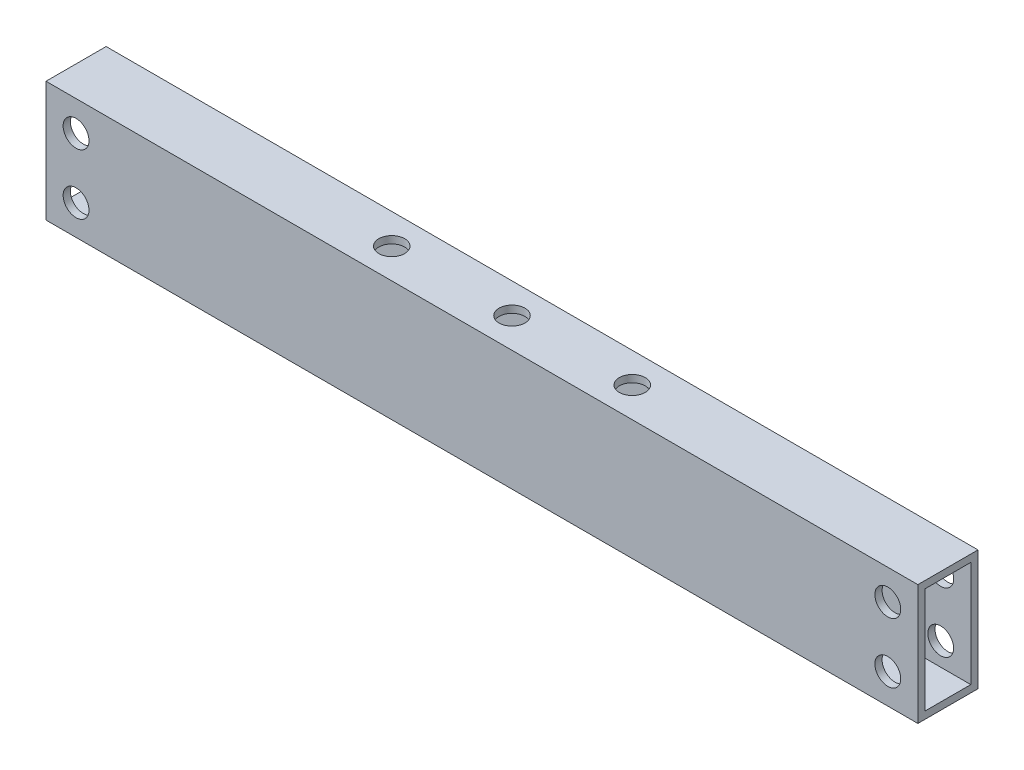
ISO-10303-21;
HEADER;
FILE_DESCRIPTION(('STEP AP214'),'2;1');
FILE_NAME('part.step','',(''),(''),'','','');
FILE_SCHEMA(('AUTOMOTIVE_DESIGN { 1 0 10303 214 1 1 1 1 }'));
ENDSEC;
DATA;
#1=APPLICATION_CONTEXT('core data for automotive mechanical design processes');
#2=APPLICATION_PROTOCOL_DEFINITION('international standard','automotive_design',2000,#1);
#3=PRODUCT_CONTEXT('',#1,'mechanical');
#4=PRODUCT('Part','Part','',(#3));
#5=PRODUCT_RELATED_PRODUCT_CATEGORY('part','',(#4));
#6=PRODUCT_DEFINITION_FORMATION('','',#4);
#7=PRODUCT_DEFINITION_CONTEXT('part definition',#1,'design');
#8=PRODUCT_DEFINITION('design','',#6,#7);
#9=PRODUCT_DEFINITION_SHAPE('','',#8);
#10=(LENGTH_UNIT() NAMED_UNIT(*) SI_UNIT(.MILLI.,.METRE.));
#11=(NAMED_UNIT(*) PLANE_ANGLE_UNIT() SI_UNIT($,.RADIAN.));
#12=(NAMED_UNIT(*) SI_UNIT($,.STERADIAN.) SOLID_ANGLE_UNIT());
#13=UNCERTAINTY_MEASURE_WITH_UNIT(LENGTH_MEASURE(1.E-05),#10,'distance_accuracy_value','');
#14=(GEOMETRIC_REPRESENTATION_CONTEXT(3) GLOBAL_UNCERTAINTY_ASSIGNED_CONTEXT((#13)) GLOBAL_UNIT_ASSIGNED_CONTEXT((#10,
#11,#12)) REPRESENTATION_CONTEXT('',''));
#15=CARTESIAN_POINT('',(0.,0.,0.));
#16=DIRECTION('',(0.,0.,1.));
#17=DIRECTION('',(1.,0.,0.));
#18=AXIS2_PLACEMENT_3D('',#15,#16,#17);
#19=CARTESIAN_POINT('',(145.,0.,0.));
#20=DIRECTION('',(1.,0.,0.));
#21=DIRECTION('',(0.,0.,-1.));
#22=AXIS2_PLACEMENT_3D('',#19,#20,#21);
#23=PLANE('',#22);
#24=DIRECTION('',(0.,1.,0.));
#25=VECTOR('',#24,1.);
#26=CARTESIAN_POINT('',(145.,10.,-5.));
#27=LINE('',#26,#25);
#28=CARTESIAN_POINT('',(145.,-10.,-5.));
#29=VERTEX_POINT('',#28);
#30=CARTESIAN_POINT('',(145.,10.,-5.));
#31=VERTEX_POINT('',#30);
#32=EDGE_CURVE('E164',#29,#31,#27,.T.);
#33=ORIENTED_EDGE('',*,*,#32,.T.);
#34=DIRECTION('',(0.,0.,1.));
#35=VECTOR('',#34,1.);
#36=CARTESIAN_POINT('',(145.,10.,5.));
#37=LINE('',#36,#35);
#38=CARTESIAN_POINT('',(145.,10.,5.));
#39=VERTEX_POINT('',#38);
#40=EDGE_CURVE('E167',#31,#39,#37,.T.);
#41=ORIENTED_EDGE('',*,*,#40,.T.);
#42=DIRECTION('',(0.,-1.,0.));
#43=VECTOR('',#42,1.);
#44=CARTESIAN_POINT('',(145.,10.,5.));
#45=LINE('',#44,#43);
#46=CARTESIAN_POINT('',(145.,-10.,5.));
#47=VERTEX_POINT('',#46);
#48=EDGE_CURVE('E170',#39,#47,#45,.T.);
#49=ORIENTED_EDGE('',*,*,#48,.T.);
#50=DIRECTION('',(0.,0.,-1.));
#51=VECTOR('',#50,1.);
#52=CARTESIAN_POINT('',(145.,-10.,5.));
#53=LINE('',#52,#51);
#54=EDGE_CURVE('E172',#47,#29,#53,.T.);
#55=ORIENTED_EDGE('',*,*,#54,.T.);
#56=EDGE_LOOP('',(#33,#41,#49,#55));
#57=FACE_BOUND('',#56,.T.);
#58=DIRECTION('',(0.,0.,1.));
#59=VECTOR('',#58,1.);
#60=CARTESIAN_POINT('',(145.,8.8,5.));
#61=LINE('',#60,#59);
#62=CARTESIAN_POINT('',(145.,8.8,-3.8));
#63=VERTEX_POINT('',#62);
#64=CARTESIAN_POINT('',(145.,8.8,3.8));
#65=VERTEX_POINT('',#64);
#66=EDGE_CURVE('E134',#63,#65,#61,.T.);
#67=ORIENTED_EDGE('',*,*,#66,.F.);
#68=DIRECTION('',(0.,1.,0.));
#69=VECTOR('',#68,1.);
#70=CARTESIAN_POINT('',(145.,10.,-3.8));
#71=LINE('',#70,#69);
#72=CARTESIAN_POINT('',(145.,-8.8,-3.8));
#73=VERTEX_POINT('',#72);
#74=EDGE_CURVE('E126',#73,#63,#71,.T.);
#75=ORIENTED_EDGE('',*,*,#74,.F.);
#76=DIRECTION('',(0.,0.,-1.));
#77=VECTOR('',#76,1.);
#78=CARTESIAN_POINT('',(145.,-8.8,5.));
#79=LINE('',#78,#77);
#80=CARTESIAN_POINT('',(145.,-8.8,3.8));
#81=VERTEX_POINT('',#80);
#82=EDGE_CURVE('E148',#81,#73,#79,.T.);
#83=ORIENTED_EDGE('',*,*,#82,.F.);
#84=DIRECTION('',(0.,-1.,0.));
#85=VECTOR('',#84,1.);
#86=CARTESIAN_POINT('',(145.,10.,3.8));
#87=LINE('',#86,#85);
#88=EDGE_CURVE('E146',#65,#81,#87,.T.);
#89=ORIENTED_EDGE('',*,*,#88,.F.);
#90=EDGE_LOOP('',(#67,#75,#83,#89));
#91=FACE_BOUND('',#90,.T.);
#92=ADVANCED_FACE('F59',(#57,#91),#23,.T.);
#93=CARTESIAN_POINT('',(0.,0.,0.));
#94=DIRECTION('',(1.,0.,0.));
#95=DIRECTION('',(0.,0.,-1.));
#96=AXIS2_PLACEMENT_3D('',#93,#94,#95);
#97=PLANE('',#96);
#98=DIRECTION('',(0.,1.,0.));
#99=VECTOR('',#98,1.);
#100=CARTESIAN_POINT('',(0.,10.,-5.));
#101=LINE('',#100,#99);
#102=CARTESIAN_POINT('',(0.,-10.,-5.));
#103=VERTEX_POINT('',#102);
#104=CARTESIAN_POINT('',(0.,10.,-5.));
#105=VERTEX_POINT('',#104);
#106=EDGE_CURVE('E142',#103,#105,#101,.T.);
#107=ORIENTED_EDGE('',*,*,#106,.F.);
#108=DIRECTION('',(0.,0.,-1.));
#109=VECTOR('',#108,1.);
#110=CARTESIAN_POINT('',(0.,-10.,5.));
#111=LINE('',#110,#109);
#112=CARTESIAN_POINT('',(0.,-10.,5.));
#113=VERTEX_POINT('',#112);
#114=EDGE_CURVE('E168',#113,#103,#111,.T.);
#115=ORIENTED_EDGE('',*,*,#114,.F.);
#116=DIRECTION('',(0.,-1.,0.));
#117=VECTOR('',#116,1.);
#118=CARTESIAN_POINT('',(0.,10.,5.));
#119=LINE('',#118,#117);
#120=CARTESIAN_POINT('',(0.,10.,5.));
#121=VERTEX_POINT('',#120);
#122=EDGE_CURVE('E179',#121,#113,#119,.T.);
#123=ORIENTED_EDGE('',*,*,#122,.F.);
#124=DIRECTION('',(0.,0.,1.));
#125=VECTOR('',#124,1.);
#126=CARTESIAN_POINT('',(0.,10.,5.));
#127=LINE('',#126,#125);
#128=EDGE_CURVE('E177',#105,#121,#127,.T.);
#129=ORIENTED_EDGE('',*,*,#128,.F.);
#130=EDGE_LOOP('',(#107,#115,#123,#129));
#131=FACE_BOUND('',#130,.T.);
#132=DIRECTION('',(0.,1.,0.));
#133=VECTOR('',#132,1.);
#134=CARTESIAN_POINT('',(0.,10.,-3.8));
#135=LINE('',#134,#133);
#136=CARTESIAN_POINT('',(0.,-8.8,-3.8));
#137=VERTEX_POINT('',#136);
#138=CARTESIAN_POINT('',(0.,8.8,-3.8));
#139=VERTEX_POINT('',#138);
#140=EDGE_CURVE('E84',#137,#139,#135,.T.);
#141=ORIENTED_EDGE('',*,*,#140,.T.);
#142=DIRECTION('',(0.,0.,1.));
#143=VECTOR('',#142,1.);
#144=CARTESIAN_POINT('',(0.,8.8,5.));
#145=LINE('',#144,#143);
#146=CARTESIAN_POINT('',(0.,8.8,3.8));
#147=VERTEX_POINT('',#146);
#148=EDGE_CURVE('E141',#139,#147,#145,.T.);
#149=ORIENTED_EDGE('',*,*,#148,.T.);
#150=DIRECTION('',(0.,-1.,0.));
#151=VECTOR('',#150,1.);
#152=CARTESIAN_POINT('',(0.,10.,3.8));
#153=LINE('',#152,#151);
#154=CARTESIAN_POINT('',(0.,-8.8,3.8));
#155=VERTEX_POINT('',#154);
#156=EDGE_CURVE('E156',#147,#155,#153,.T.);
#157=ORIENTED_EDGE('',*,*,#156,.T.);
#158=DIRECTION('',(0.,0.,-1.));
#159=VECTOR('',#158,1.);
#160=CARTESIAN_POINT('',(0.,-8.8,5.));
#161=LINE('',#160,#159);
#162=EDGE_CURVE('E135',#155,#137,#161,.T.);
#163=ORIENTED_EDGE('',*,*,#162,.T.);
#164=EDGE_LOOP('',(#141,#149,#157,#163));
#165=FACE_BOUND('',#164,.T.);
#166=ADVANCED_FACE('F283',(#131,#165),#97,.F.);
#167=CARTESIAN_POINT('',(145.,10.,-5.));
#168=DIRECTION('',(0.,0.,1.));
#169=DIRECTION('',(0.,-1.,0.));
#170=AXIS2_PLACEMENT_3D('',#167,#168,#169);
#171=PLANE('',#170);
#172=CARTESIAN_POINT('',(140.,-5.,-5.));
#173=DIRECTION('',(0.,0.,1.));
#174=DIRECTION('',(-1.,0.,0.));
#175=AXIS2_PLACEMENT_3D('',#172,#173,#174);
#176=CIRCLE('',#175,2.15000000000002);
#177=CARTESIAN_POINT('',(137.85,-5.,-5.));
#178=VERTEX_POINT('',#177);
#179=EDGE_CURVE('E323',#178,#178,#176,.T.);
#180=ORIENTED_EDGE('',*,*,#179,.T.);
#181=EDGE_LOOP('',(#180));
#182=FACE_BOUND('',#181,.T.);
#183=CARTESIAN_POINT('',(5.,4.99999999999998,-5.));
#184=DIRECTION('',(0.,0.,1.));
#185=DIRECTION('',(-1.,0.,0.));
#186=AXIS2_PLACEMENT_3D('',#183,#184,#185);
#187=CIRCLE('',#186,2.15);
#188=CARTESIAN_POINT('',(2.85,4.99999999999998,-5.));
#189=VERTEX_POINT('',#188);
#190=EDGE_CURVE('E330',#189,#189,#187,.T.);
#191=ORIENTED_EDGE('',*,*,#190,.T.);
#192=EDGE_LOOP('',(#191));
#193=FACE_BOUND('',#192,.T.);
#194=CARTESIAN_POINT('',(5.,-5.00000000000002,-5.));
#195=DIRECTION('',(0.,0.,1.));
#196=DIRECTION('',(1.,0.,0.));
#197=AXIS2_PLACEMENT_3D('',#194,#195,#196);
#198=CIRCLE('',#197,2.15);
#199=CARTESIAN_POINT('',(7.15000000000001,-5.00000000000002,-5.));
#200=VERTEX_POINT('',#199);
#201=EDGE_CURVE('E331',#200,#200,#198,.T.);
#202=ORIENTED_EDGE('',*,*,#201,.T.);
#203=EDGE_LOOP('',(#202));
#204=FACE_BOUND('',#203,.T.);
#205=CARTESIAN_POINT('',(140.,5.,-5.));
#206=DIRECTION('',(0.,0.,1.));
#207=DIRECTION('',(1.,0.,0.));
#208=AXIS2_PLACEMENT_3D('',#205,#206,#207);
#209=CIRCLE('',#208,2.15000000000002);
#210=CARTESIAN_POINT('',(142.15,5.,-5.));
#211=VERTEX_POINT('',#210);
#212=EDGE_CURVE('E205',#211,#211,#209,.T.);
#213=ORIENTED_EDGE('',*,*,#212,.T.);
#214=EDGE_LOOP('',(#213));
#215=FACE_BOUND('',#214,.T.);
#216=ORIENTED_EDGE('',*,*,#106,.T.);
#217=DIRECTION('',(-1.,0.,0.));
#218=VECTOR('',#217,1.);
#219=CARTESIAN_POINT('',(145.,10.,-5.));
#220=LINE('',#219,#218);
#221=EDGE_CURVE('E12',#31,#105,#220,.T.);
#222=ORIENTED_EDGE('',*,*,#221,.F.);
#223=ORIENTED_EDGE('',*,*,#32,.F.);
#224=DIRECTION('',(-1.,0.,0.));
#225=VECTOR('',#224,1.);
#226=CARTESIAN_POINT('',(145.,-10.,-5.));
#227=LINE('',#226,#225);
#228=EDGE_CURVE('E174',#29,#103,#227,.T.);
#229=ORIENTED_EDGE('',*,*,#228,.T.);
#230=EDGE_LOOP('',(#216,#222,#223,#229));
#231=FACE_BOUND('',#230,.T.);
#232=ADVANCED_FACE('F61',(#182,#193,#204,#215,#231),#171,.F.);
#233=CARTESIAN_POINT('',(145.,10.,5.));
#234=DIRECTION('',(0.,-1.,0.));
#235=DIRECTION('',(0.,0.,-1.));
#236=AXIS2_PLACEMENT_3D('',#233,#234,#235);
#237=PLANE('',#236);
#238=CARTESIAN_POINT('',(92.5,10.,0.));
#239=DIRECTION('',(0.,1.,0.));
#240=DIRECTION('',(0.,0.,1.));
#241=AXIS2_PLACEMENT_3D('',#238,#239,#240);
#242=CIRCLE('',#241,2.15);
#243=CARTESIAN_POINT('',(92.5,10.,2.15));
#244=VERTEX_POINT('',#243);
#245=EDGE_CURVE('E229',#244,#244,#242,.T.);
#246=ORIENTED_EDGE('',*,*,#245,.F.);
#247=EDGE_LOOP('',(#246));
#248=FACE_BOUND('',#247,.T.);
#249=CARTESIAN_POINT('',(52.5,10.,0.));
#250=DIRECTION('',(0.,1.,0.));
#251=DIRECTION('',(0.,0.,-1.));
#252=AXIS2_PLACEMENT_3D('',#249,#250,#251);
#253=CIRCLE('',#252,2.15);
#254=CARTESIAN_POINT('',(52.5,10.,-2.15));
#255=VERTEX_POINT('',#254);
#256=EDGE_CURVE('E235',#255,#255,#253,.T.);
#257=ORIENTED_EDGE('',*,*,#256,.F.);
#258=EDGE_LOOP('',(#257));
#259=FACE_BOUND('',#258,.T.);
#260=CARTESIAN_POINT('',(72.5,10.,0.));
#261=DIRECTION('',(0.,1.,0.));
#262=DIRECTION('',(0.,0.,1.));
#263=AXIS2_PLACEMENT_3D('',#260,#261,#262);
#264=CIRCLE('',#263,2.15);
#265=CARTESIAN_POINT('',(72.5,10.,2.15));
#266=VERTEX_POINT('',#265);
#267=EDGE_CURVE('E226',#266,#266,#264,.T.);
#268=ORIENTED_EDGE('',*,*,#267,.F.);
#269=EDGE_LOOP('',(#268));
#270=FACE_BOUND('',#269,.T.);
#271=ORIENTED_EDGE('',*,*,#128,.T.);
#272=DIRECTION('',(-1.,0.,0.));
#273=VECTOR('',#272,1.);
#274=CARTESIAN_POINT('',(145.,10.,5.));
#275=LINE('',#274,#273);
#276=EDGE_CURVE('E68',#39,#121,#275,.T.);
#277=ORIENTED_EDGE('',*,*,#276,.F.);
#278=ORIENTED_EDGE('',*,*,#40,.F.);
#279=ORIENTED_EDGE('',*,*,#221,.T.);
#280=EDGE_LOOP('',(#271,#277,#278,#279));
#281=FACE_BOUND('',#280,.T.);
#282=ADVANCED_FACE('F269',(#248,#259,#270,#281),#237,.F.);
#283=CARTESIAN_POINT('',(145.,10.,5.));
#284=DIRECTION('',(0.,0.,-1.));
#285=DIRECTION('',(0.,1.,0.));
#286=AXIS2_PLACEMENT_3D('',#283,#284,#285);
#287=PLANE('',#286);
#288=CARTESIAN_POINT('',(140.,-5.,5.));
#289=DIRECTION('',(0.,0.,1.));
#290=DIRECTION('',(-1.,0.,0.));
#291=AXIS2_PLACEMENT_3D('',#288,#289,#290);
#292=CIRCLE('',#291,2.15000000000002);
#293=CARTESIAN_POINT('',(137.85,-5.,5.));
#294=VERTEX_POINT('',#293);
#295=EDGE_CURVE('E310',#294,#294,#292,.T.);
#296=ORIENTED_EDGE('',*,*,#295,.F.);
#297=EDGE_LOOP('',(#296));
#298=FACE_BOUND('',#297,.T.);
#299=CARTESIAN_POINT('',(5.,4.99999999999998,5.));
#300=DIRECTION('',(0.,0.,1.));
#301=DIRECTION('',(-1.,0.,0.));
#302=AXIS2_PLACEMENT_3D('',#299,#300,#301);
#303=CIRCLE('',#302,2.15);
#304=CARTESIAN_POINT('',(2.85,4.99999999999998,5.));
#305=VERTEX_POINT('',#304);
#306=EDGE_CURVE('E314',#305,#305,#303,.T.);
#307=ORIENTED_EDGE('',*,*,#306,.F.);
#308=EDGE_LOOP('',(#307));
#309=FACE_BOUND('',#308,.T.);
#310=CARTESIAN_POINT('',(5.,-5.00000000000002,5.));
#311=DIRECTION('',(0.,0.,1.));
#312=DIRECTION('',(1.,0.,0.));
#313=AXIS2_PLACEMENT_3D('',#310,#311,#312);
#314=CIRCLE('',#313,2.15);
#315=CARTESIAN_POINT('',(7.15000000000001,-5.00000000000002,5.));
#316=VERTEX_POINT('',#315);
#317=EDGE_CURVE('E318',#316,#316,#314,.T.);
#318=ORIENTED_EDGE('',*,*,#317,.F.);
#319=EDGE_LOOP('',(#318));
#320=FACE_BOUND('',#319,.T.);
#321=CARTESIAN_POINT('',(140.,5.,5.));
#322=DIRECTION('',(0.,0.,1.));
#323=DIRECTION('',(1.,0.,0.));
#324=AXIS2_PLACEMENT_3D('',#321,#322,#323);
#325=CIRCLE('',#324,2.15000000000002);
#326=CARTESIAN_POINT('',(142.15,5.,5.));
#327=VERTEX_POINT('',#326);
#328=EDGE_CURVE('E321',#327,#327,#325,.T.);
#329=ORIENTED_EDGE('',*,*,#328,.F.);
#330=EDGE_LOOP('',(#329));
#331=FACE_BOUND('',#330,.T.);
#332=ORIENTED_EDGE('',*,*,#122,.T.);
#333=DIRECTION('',(-1.,0.,0.));
#334=VECTOR('',#333,1.);
#335=CARTESIAN_POINT('',(145.,-10.,5.));
#336=LINE('',#335,#334);
#337=EDGE_CURVE('E184',#47,#113,#336,.T.);
#338=ORIENTED_EDGE('',*,*,#337,.F.);
#339=ORIENTED_EDGE('',*,*,#48,.F.);
#340=ORIENTED_EDGE('',*,*,#276,.T.);
#341=EDGE_LOOP('',(#332,#338,#339,#340));
#342=FACE_BOUND('',#341,.T.);
#343=ADVANCED_FACE('F272',(#298,#309,#320,#331,#342),#287,.F.);
#344=CARTESIAN_POINT('',(145.,-10.,5.));
#345=DIRECTION('',(0.,1.,0.));
#346=DIRECTION('',(0.,0.,1.));
#347=AXIS2_PLACEMENT_3D('',#344,#345,#346);
#348=PLANE('',#347);
#349=CARTESIAN_POINT('',(92.5,-9.99999999999999,0.));
#350=DIRECTION('',(0.,1.,0.));
#351=DIRECTION('',(0.,0.,1.));
#352=AXIS2_PLACEMENT_3D('',#349,#350,#351);
#353=CIRCLE('',#352,2.15);
#354=CARTESIAN_POINT('',(92.5,-9.99999999999999,2.15));
#355=VERTEX_POINT('',#354);
#356=EDGE_CURVE('E193',#355,#355,#353,.T.);
#357=ORIENTED_EDGE('',*,*,#356,.T.);
#358=EDGE_LOOP('',(#357));
#359=FACE_BOUND('',#358,.T.);
#360=CARTESIAN_POINT('',(52.5,-9.99999999999999,0.));
#361=DIRECTION('',(0.,1.,0.));
#362=DIRECTION('',(0.,0.,-1.));
#363=AXIS2_PLACEMENT_3D('',#360,#361,#362);
#364=CIRCLE('',#363,2.15);
#365=CARTESIAN_POINT('',(52.5,-9.99999999999999,-2.15));
#366=VERTEX_POINT('',#365);
#367=EDGE_CURVE('E232',#366,#366,#364,.T.);
#368=ORIENTED_EDGE('',*,*,#367,.T.);
#369=EDGE_LOOP('',(#368));
#370=FACE_BOUND('',#369,.T.);
#371=CARTESIAN_POINT('',(72.5,-9.99999999999999,0.));
#372=DIRECTION('',(0.,1.,0.));
#373=DIRECTION('',(0.,0.,1.));
#374=AXIS2_PLACEMENT_3D('',#371,#372,#373);
#375=CIRCLE('',#374,2.15);
#376=CARTESIAN_POINT('',(72.5,-9.99999999999999,2.15));
#377=VERTEX_POINT('',#376);
#378=EDGE_CURVE('E238',#377,#377,#375,.T.);
#379=ORIENTED_EDGE('',*,*,#378,.T.);
#380=EDGE_LOOP('',(#379));
#381=FACE_BOUND('',#380,.T.);
#382=ORIENTED_EDGE('',*,*,#114,.T.);
#383=ORIENTED_EDGE('',*,*,#228,.F.);
#384=ORIENTED_EDGE('',*,*,#54,.F.);
#385=ORIENTED_EDGE('',*,*,#337,.T.);
#386=EDGE_LOOP('',(#382,#383,#384,#385));
#387=FACE_BOUND('',#386,.T.);
#388=ADVANCED_FACE('F287',(#359,#370,#381,#387),#348,.F.);
#389=CARTESIAN_POINT('',(145.,10.,-3.8));
#390=DIRECTION('',(0.,0.,1.));
#391=DIRECTION('',(0.,-1.,0.));
#392=AXIS2_PLACEMENT_3D('',#389,#390,#391);
#393=PLANE('',#392);
#394=CARTESIAN_POINT('',(140.,-5.,-3.8));
#395=DIRECTION('',(0.,0.,1.));
#396=DIRECTION('',(0.,-1.,0.));
#397=AXIS2_PLACEMENT_3D('',#394,#395,#396);
#398=CIRCLE('',#397,2.15000000000002);
#399=CARTESIAN_POINT('',(140.,-7.15000000000002,-3.8));
#400=VERTEX_POINT('',#399);
#401=EDGE_CURVE('E223',#400,#400,#398,.T.);
#402=ORIENTED_EDGE('',*,*,#401,.F.);
#403=EDGE_LOOP('',(#402));
#404=FACE_BOUND('',#403,.T.);
#405=CARTESIAN_POINT('',(5.,4.99999999999998,-3.8));
#406=DIRECTION('',(0.,0.,1.));
#407=DIRECTION('',(0.,-1.,0.));
#408=AXIS2_PLACEMENT_3D('',#405,#406,#407);
#409=CIRCLE('',#408,2.15);
#410=CARTESIAN_POINT('',(5.,2.84999999999998,-3.8));
#411=VERTEX_POINT('',#410);
#412=EDGE_CURVE('E211',#411,#411,#409,.T.);
#413=ORIENTED_EDGE('',*,*,#412,.F.);
#414=EDGE_LOOP('',(#413));
#415=FACE_BOUND('',#414,.T.);
#416=CARTESIAN_POINT('',(5.,-5.00000000000002,-3.8));
#417=DIRECTION('',(0.,0.,1.));
#418=DIRECTION('',(0.,-1.,0.));
#419=AXIS2_PLACEMENT_3D('',#416,#417,#418);
#420=CIRCLE('',#419,2.15);
#421=CARTESIAN_POINT('',(5.,-7.15000000000002,-3.8));
#422=VERTEX_POINT('',#421);
#423=EDGE_CURVE('E208',#422,#422,#420,.T.);
#424=ORIENTED_EDGE('',*,*,#423,.F.);
#425=EDGE_LOOP('',(#424));
#426=FACE_BOUND('',#425,.T.);
#427=CARTESIAN_POINT('',(140.,5.,-3.8));
#428=DIRECTION('',(0.,0.,1.));
#429=DIRECTION('',(0.,-1.,0.));
#430=AXIS2_PLACEMENT_3D('',#427,#428,#429);
#431=CIRCLE('',#430,2.15000000000002);
#432=CARTESIAN_POINT('',(140.,2.84999999999998,-3.8));
#433=VERTEX_POINT('',#432);
#434=EDGE_CURVE('E204',#433,#433,#431,.T.);
#435=ORIENTED_EDGE('',*,*,#434,.F.);
#436=EDGE_LOOP('',(#435));
#437=FACE_BOUND('',#436,.T.);
#438=ORIENTED_EDGE('',*,*,#140,.F.);
#439=DIRECTION('',(-1.,0.,0.));
#440=VECTOR('',#439,1.);
#441=CARTESIAN_POINT('',(145.,-8.8,-3.8));
#442=LINE('',#441,#440);
#443=EDGE_CURVE('E130',#73,#137,#442,.T.);
#444=ORIENTED_EDGE('',*,*,#443,.F.);
#445=ORIENTED_EDGE('',*,*,#74,.T.);
#446=DIRECTION('',(-1.,0.,0.));
#447=VECTOR('',#446,1.);
#448=CARTESIAN_POINT('',(145.,8.8,-3.8));
#449=LINE('',#448,#447);
#450=EDGE_CURVE('E129',#63,#139,#449,.T.);
#451=ORIENTED_EDGE('',*,*,#450,.T.);
#452=EDGE_LOOP('',(#438,#444,#445,#451));
#453=FACE_BOUND('',#452,.T.);
#454=ADVANCED_FACE('F128',(#404,#415,#426,#437,#453),#393,.T.);
#455=CARTESIAN_POINT('',(145.,8.8,5.));
#456=DIRECTION('',(0.,-1.,0.));
#457=DIRECTION('',(0.,0.,-1.));
#458=AXIS2_PLACEMENT_3D('',#455,#456,#457);
#459=PLANE('',#458);
#460=CARTESIAN_POINT('',(92.5,8.8,0.));
#461=DIRECTION('',(0.,-1.,0.));
#462=DIRECTION('',(0.,0.,-1.));
#463=AXIS2_PLACEMENT_3D('',#460,#461,#462);
#464=CIRCLE('',#463,2.15);
#465=CARTESIAN_POINT('',(92.5,8.8,-2.15));
#466=VERTEX_POINT('',#465);
#467=EDGE_CURVE('E154',#466,#466,#464,.T.);
#468=ORIENTED_EDGE('',*,*,#467,.F.);
#469=EDGE_LOOP('',(#468));
#470=FACE_BOUND('',#469,.T.);
#471=CARTESIAN_POINT('',(52.5,8.8,0.));
#472=DIRECTION('',(0.,-1.,0.));
#473=DIRECTION('',(0.,0.,-1.));
#474=AXIS2_PLACEMENT_3D('',#471,#472,#473);
#475=CIRCLE('',#474,2.15);
#476=CARTESIAN_POINT('',(52.5,8.8,-2.15));
#477=VERTEX_POINT('',#476);
#478=EDGE_CURVE('E197',#477,#477,#475,.T.);
#479=ORIENTED_EDGE('',*,*,#478,.F.);
#480=EDGE_LOOP('',(#479));
#481=FACE_BOUND('',#480,.T.);
#482=CARTESIAN_POINT('',(72.5,8.8,0.));
#483=DIRECTION('',(0.,-1.,0.));
#484=DIRECTION('',(0.,0.,-1.));
#485=AXIS2_PLACEMENT_3D('',#482,#483,#484);
#486=CIRCLE('',#485,2.15);
#487=CARTESIAN_POINT('',(72.5,8.8,-2.15));
#488=VERTEX_POINT('',#487);
#489=EDGE_CURVE('E192',#488,#488,#486,.T.);
#490=ORIENTED_EDGE('',*,*,#489,.F.);
#491=EDGE_LOOP('',(#490));
#492=FACE_BOUND('',#491,.T.);
#493=ORIENTED_EDGE('',*,*,#148,.F.);
#494=ORIENTED_EDGE('',*,*,#450,.F.);
#495=ORIENTED_EDGE('',*,*,#66,.T.);
#496=DIRECTION('',(-1.,0.,0.));
#497=VECTOR('',#496,1.);
#498=CARTESIAN_POINT('',(145.,8.8,3.8));
#499=LINE('',#498,#497);
#500=EDGE_CURVE('E143',#65,#147,#499,.T.);
#501=ORIENTED_EDGE('',*,*,#500,.T.);
#502=EDGE_LOOP('',(#493,#494,#495,#501));
#503=FACE_BOUND('',#502,.T.);
#504=ADVANCED_FACE('F138',(#470,#481,#492,#503),#459,.T.);
#505=CARTESIAN_POINT('',(145.,10.,3.8));
#506=DIRECTION('',(0.,0.,-1.));
#507=DIRECTION('',(0.,1.,0.));
#508=AXIS2_PLACEMENT_3D('',#505,#506,#507);
#509=PLANE('',#508);
#510=CARTESIAN_POINT('',(140.,-5.,3.8));
#511=DIRECTION('',(0.,0.,-1.));
#512=DIRECTION('',(0.,1.,0.));
#513=AXIS2_PLACEMENT_3D('',#510,#511,#512);
#514=CIRCLE('',#513,2.15000000000002);
#515=CARTESIAN_POINT('',(140.,-2.84999999999999,3.8));
#516=VERTEX_POINT('',#515);
#517=EDGE_CURVE('E63',#516,#516,#514,.T.);
#518=ORIENTED_EDGE('',*,*,#517,.F.);
#519=EDGE_LOOP('',(#518));
#520=FACE_BOUND('',#519,.T.);
#521=CARTESIAN_POINT('',(5.,4.99999999999998,3.8));
#522=DIRECTION('',(0.,0.,-1.));
#523=DIRECTION('',(0.,1.,0.));
#524=AXIS2_PLACEMENT_3D('',#521,#522,#523);
#525=CIRCLE('',#524,2.15);
#526=CARTESIAN_POINT('',(5.,7.14999999999998,3.8));
#527=VERTEX_POINT('',#526);
#528=EDGE_CURVE('E209',#527,#527,#525,.T.);
#529=ORIENTED_EDGE('',*,*,#528,.F.);
#530=EDGE_LOOP('',(#529));
#531=FACE_BOUND('',#530,.T.);
#532=CARTESIAN_POINT('',(5.,-5.00000000000002,3.8));
#533=DIRECTION('',(0.,0.,-1.));
#534=DIRECTION('',(0.,1.,0.));
#535=AXIS2_PLACEMENT_3D('',#532,#533,#534);
#536=CIRCLE('',#535,2.15);
#537=CARTESIAN_POINT('',(5.,-2.85000000000002,3.8));
#538=VERTEX_POINT('',#537);
#539=EDGE_CURVE('E206',#538,#538,#536,.T.);
#540=ORIENTED_EDGE('',*,*,#539,.F.);
#541=EDGE_LOOP('',(#540));
#542=FACE_BOUND('',#541,.T.);
#543=CARTESIAN_POINT('',(140.,5.,3.8));
#544=DIRECTION('',(0.,0.,-1.));
#545=DIRECTION('',(0.,1.,0.));
#546=AXIS2_PLACEMENT_3D('',#543,#544,#545);
#547=CIRCLE('',#546,2.15000000000002);
#548=CARTESIAN_POINT('',(140.,7.15000000000001,3.8));
#549=VERTEX_POINT('',#548);
#550=EDGE_CURVE('E201',#549,#549,#547,.T.);
#551=ORIENTED_EDGE('',*,*,#550,.F.);
#552=EDGE_LOOP('',(#551));
#553=FACE_BOUND('',#552,.T.);
#554=ORIENTED_EDGE('',*,*,#156,.F.);
#555=ORIENTED_EDGE('',*,*,#500,.F.);
#556=ORIENTED_EDGE('',*,*,#88,.T.);
#557=DIRECTION('',(-1.,0.,0.));
#558=VECTOR('',#557,1.);
#559=CARTESIAN_POINT('',(145.,-8.8,3.8));
#560=LINE('',#559,#558);
#561=EDGE_CURVE('E76',#81,#155,#560,.T.);
#562=ORIENTED_EDGE('',*,*,#561,.T.);
#563=EDGE_LOOP('',(#554,#555,#556,#562));
#564=FACE_BOUND('',#563,.T.);
#565=ADVANCED_FACE('F254',(#520,#531,#542,#553,#564),#509,.T.);
#566=CARTESIAN_POINT('',(145.,-8.8,5.));
#567=DIRECTION('',(0.,1.,0.));
#568=DIRECTION('',(0.,0.,1.));
#569=AXIS2_PLACEMENT_3D('',#566,#567,#568);
#570=PLANE('',#569);
#571=CARTESIAN_POINT('',(92.5,-8.8,0.));
#572=DIRECTION('',(0.,1.,0.));
#573=DIRECTION('',(0.,0.,1.));
#574=AXIS2_PLACEMENT_3D('',#571,#572,#573);
#575=CIRCLE('',#574,2.15);
#576=CARTESIAN_POINT('',(92.5,-8.8,2.15));
#577=VERTEX_POINT('',#576);
#578=EDGE_CURVE('E198',#577,#577,#575,.T.);
#579=ORIENTED_EDGE('',*,*,#578,.F.);
#580=EDGE_LOOP('',(#579));
#581=FACE_BOUND('',#580,.T.);
#582=CARTESIAN_POINT('',(52.5,-8.8,0.));
#583=DIRECTION('',(0.,1.,0.));
#584=DIRECTION('',(0.,0.,1.));
#585=AXIS2_PLACEMENT_3D('',#582,#583,#584);
#586=CIRCLE('',#585,2.15);
#587=CARTESIAN_POINT('',(52.5,-8.8,2.15000000000001));
#588=VERTEX_POINT('',#587);
#589=EDGE_CURVE('E194',#588,#588,#586,.T.);
#590=ORIENTED_EDGE('',*,*,#589,.F.);
#591=EDGE_LOOP('',(#590));
#592=FACE_BOUND('',#591,.T.);
#593=CARTESIAN_POINT('',(72.5,-8.8,0.));
#594=DIRECTION('',(0.,1.,0.));
#595=DIRECTION('',(0.,0.,1.));
#596=AXIS2_PLACEMENT_3D('',#593,#594,#595);
#597=CIRCLE('',#596,2.15);
#598=CARTESIAN_POINT('',(72.5,-8.8,2.15));
#599=VERTEX_POINT('',#598);
#600=EDGE_CURVE('E189',#599,#599,#597,.T.);
#601=ORIENTED_EDGE('',*,*,#600,.F.);
#602=EDGE_LOOP('',(#601));
#603=FACE_BOUND('',#602,.T.);
#604=ORIENTED_EDGE('',*,*,#162,.F.);
#605=ORIENTED_EDGE('',*,*,#561,.F.);
#606=ORIENTED_EDGE('',*,*,#82,.T.);
#607=ORIENTED_EDGE('',*,*,#443,.T.);
#608=EDGE_LOOP('',(#604,#605,#606,#607));
#609=FACE_BOUND('',#608,.T.);
#610=ADVANCED_FACE('F372',(#581,#592,#603,#609),#570,.T.);
#611=CARTESIAN_POINT('',(72.5,-9.99999999999999,0.));
#612=DIRECTION('',(0.,1.,0.));
#613=DIRECTION('',(0.,0.,1.));
#614=AXIS2_PLACEMENT_3D('',#611,#612,#613);
#615=CYLINDRICAL_SURFACE('',#614,2.15);
#616=ORIENTED_EDGE('',*,*,#600,.T.);
#617=EDGE_LOOP('',(#616));
#618=FACE_BOUND('',#617,.T.);
#619=ORIENTED_EDGE('',*,*,#378,.F.);
#620=EDGE_LOOP('',(#619));
#621=FACE_BOUND('',#620,.T.);
#622=ADVANCED_FACE('F266',(#618,#621),#615,.F.);
#623=CARTESIAN_POINT('',(52.5,-9.99999999999999,0.));
#624=DIRECTION('',(0.,1.,0.));
#625=DIRECTION('',(0.,0.,1.));
#626=AXIS2_PLACEMENT_3D('',#623,#624,#625);
#627=CYLINDRICAL_SURFACE('',#626,2.15);
#628=ORIENTED_EDGE('',*,*,#589,.T.);
#629=EDGE_LOOP('',(#628));
#630=FACE_BOUND('',#629,.T.);
#631=ORIENTED_EDGE('',*,*,#367,.F.);
#632=EDGE_LOOP('',(#631));
#633=FACE_BOUND('',#632,.T.);
#634=ADVANCED_FACE('F384',(#630,#633),#627,.F.);
#635=CARTESIAN_POINT('',(92.5,-9.99999999999999,0.));
#636=DIRECTION('',(0.,1.,0.));
#637=DIRECTION('',(0.,0.,1.));
#638=AXIS2_PLACEMENT_3D('',#635,#636,#637);
#639=CYLINDRICAL_SURFACE('',#638,2.15);
#640=ORIENTED_EDGE('',*,*,#578,.T.);
#641=EDGE_LOOP('',(#640));
#642=FACE_BOUND('',#641,.T.);
#643=ORIENTED_EDGE('',*,*,#356,.F.);
#644=EDGE_LOOP('',(#643));
#645=FACE_BOUND('',#644,.T.);
#646=ADVANCED_FACE('F264',(#642,#645),#639,.F.);
#647=ORIENTED_EDGE('',*,*,#489,.T.);
#648=EDGE_LOOP('',(#647));
#649=FACE_BOUND('',#648,.T.);
#650=ORIENTED_EDGE('',*,*,#267,.T.);
#651=EDGE_LOOP('',(#650));
#652=FACE_BOUND('',#651,.T.);
#653=ADVANCED_FACE('F260',(#649,#652),#615,.F.);
#654=ORIENTED_EDGE('',*,*,#478,.T.);
#655=EDGE_LOOP('',(#654));
#656=FACE_BOUND('',#655,.T.);
#657=ORIENTED_EDGE('',*,*,#256,.T.);
#658=EDGE_LOOP('',(#657));
#659=FACE_BOUND('',#658,.T.);
#660=ADVANCED_FACE('F263',(#656,#659),#627,.F.);
#661=ORIENTED_EDGE('',*,*,#467,.T.);
#662=EDGE_LOOP('',(#661));
#663=FACE_BOUND('',#662,.T.);
#664=ORIENTED_EDGE('',*,*,#245,.T.);
#665=EDGE_LOOP('',(#664));
#666=FACE_BOUND('',#665,.T.);
#667=ADVANCED_FACE('F249',(#663,#666),#639,.F.);
#668=CARTESIAN_POINT('',(140.,5.,-5.));
#669=DIRECTION('',(0.,0.,1.));
#670=DIRECTION('',(1.,0.,0.));
#671=AXIS2_PLACEMENT_3D('',#668,#669,#670);
#672=CYLINDRICAL_SURFACE('',#671,2.15000000000002);
#673=ORIENTED_EDGE('',*,*,#550,.T.);
#674=EDGE_LOOP('',(#673));
#675=FACE_BOUND('',#674,.T.);
#676=ORIENTED_EDGE('',*,*,#328,.T.);
#677=EDGE_LOOP('',(#676));
#678=FACE_BOUND('',#677,.T.);
#679=ADVANCED_FACE('F358',(#675,#678),#672,.F.);
#680=CARTESIAN_POINT('',(5.,-5.00000000000002,-5.));
#681=DIRECTION('',(0.,0.,1.));
#682=DIRECTION('',(1.,0.,0.));
#683=AXIS2_PLACEMENT_3D('',#680,#681,#682);
#684=CYLINDRICAL_SURFACE('',#683,2.15);
#685=ORIENTED_EDGE('',*,*,#539,.T.);
#686=EDGE_LOOP('',(#685));
#687=FACE_BOUND('',#686,.T.);
#688=ORIENTED_EDGE('',*,*,#317,.T.);
#689=EDGE_LOOP('',(#688));
#690=FACE_BOUND('',#689,.T.);
#691=ADVANCED_FACE('F346',(#687,#690),#684,.F.);
#692=CARTESIAN_POINT('',(5.,4.99999999999998,-5.));
#693=DIRECTION('',(0.,0.,1.));
#694=DIRECTION('',(1.,0.,0.));
#695=AXIS2_PLACEMENT_3D('',#692,#693,#694);
#696=CYLINDRICAL_SURFACE('',#695,2.15);
#697=ORIENTED_EDGE('',*,*,#528,.T.);
#698=EDGE_LOOP('',(#697));
#699=FACE_BOUND('',#698,.T.);
#700=ORIENTED_EDGE('',*,*,#306,.T.);
#701=EDGE_LOOP('',(#700));
#702=FACE_BOUND('',#701,.T.);
#703=ADVANCED_FACE('F354',(#699,#702),#696,.F.);
#704=CARTESIAN_POINT('',(140.,-5.,-5.));
#705=DIRECTION('',(0.,0.,1.));
#706=DIRECTION('',(1.,0.,0.));
#707=AXIS2_PLACEMENT_3D('',#704,#705,#706);
#708=CYLINDRICAL_SURFACE('',#707,2.15000000000002);
#709=ORIENTED_EDGE('',*,*,#517,.T.);
#710=EDGE_LOOP('',(#709));
#711=FACE_BOUND('',#710,.T.);
#712=ORIENTED_EDGE('',*,*,#295,.T.);
#713=EDGE_LOOP('',(#712));
#714=FACE_BOUND('',#713,.T.);
#715=ADVANCED_FACE('F355',(#711,#714),#708,.F.);
#716=ORIENTED_EDGE('',*,*,#434,.T.);
#717=EDGE_LOOP('',(#716));
#718=FACE_BOUND('',#717,.T.);
#719=ORIENTED_EDGE('',*,*,#212,.F.);
#720=EDGE_LOOP('',(#719));
#721=FACE_BOUND('',#720,.T.);
#722=ADVANCED_FACE('F344',(#718,#721),#672,.F.);
#723=ORIENTED_EDGE('',*,*,#423,.T.);
#724=EDGE_LOOP('',(#723));
#725=FACE_BOUND('',#724,.T.);
#726=ORIENTED_EDGE('',*,*,#201,.F.);
#727=EDGE_LOOP('',(#726));
#728=FACE_BOUND('',#727,.T.);
#729=ADVANCED_FACE('F341',(#725,#728),#684,.F.);
#730=ORIENTED_EDGE('',*,*,#412,.T.);
#731=EDGE_LOOP('',(#730));
#732=FACE_BOUND('',#731,.T.);
#733=ORIENTED_EDGE('',*,*,#190,.F.);
#734=EDGE_LOOP('',(#733));
#735=FACE_BOUND('',#734,.T.);
#736=ADVANCED_FACE('F343',(#732,#735),#696,.F.);
#737=ORIENTED_EDGE('',*,*,#401,.T.);
#738=EDGE_LOOP('',(#737));
#739=FACE_BOUND('',#738,.T.);
#740=ORIENTED_EDGE('',*,*,#179,.F.);
#741=EDGE_LOOP('',(#740));
#742=FACE_BOUND('',#741,.T.);
#743=ADVANCED_FACE('F351',(#739,#742),#708,.F.);
#744=CLOSED_SHELL('',(#92,#166,#232,#282,#343,#388,#454,#504,#565,#610,#622,#634,#646,#653,#660,
#667,#679,#691,#703,#715,#722,#729,#736,#743));
#745=MANIFOLD_SOLID_BREP('B2',#744);
#746=ADVANCED_BREP_SHAPE_REPRESENTATION('',(#18,#745),#14);
#747=SHAPE_DEFINITION_REPRESENTATION(#9,#746);
ENDSEC;
END-ISO-10303-21;
